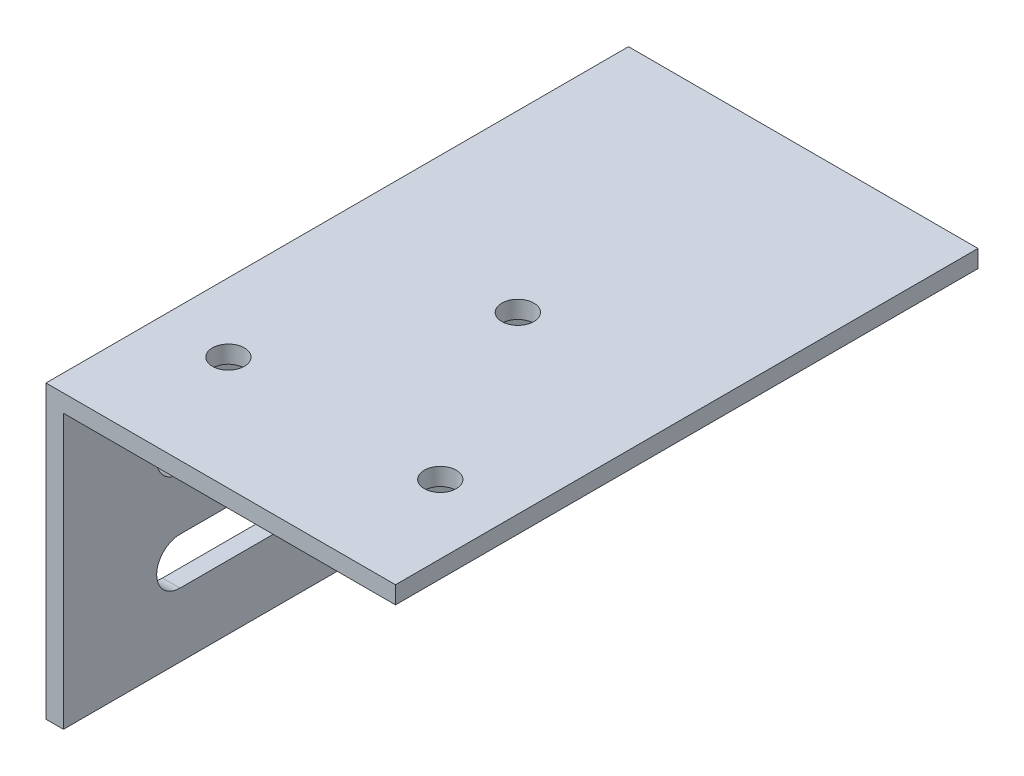
ISO-10303-21;
HEADER;
FILE_DESCRIPTION(('STEP AP214'),'2;1');
FILE_NAME('part.step','',(''),(''),'','','');
FILE_SCHEMA(('AUTOMOTIVE_DESIGN { 1 0 10303 214 1 1 1 1 }'));
ENDSEC;
DATA;
#1=APPLICATION_CONTEXT('core data for automotive mechanical design processes');
#2=APPLICATION_PROTOCOL_DEFINITION('international standard','automotive_design',2000,#1);
#3=PRODUCT_CONTEXT('',#1,'mechanical');
#4=PRODUCT('Part','Part','',(#3));
#5=PRODUCT_RELATED_PRODUCT_CATEGORY('part','',(#4));
#6=PRODUCT_DEFINITION_FORMATION('','',#4);
#7=PRODUCT_DEFINITION_CONTEXT('part definition',#1,'design');
#8=PRODUCT_DEFINITION('design','',#6,#7);
#9=PRODUCT_DEFINITION_SHAPE('','',#8);
#10=(LENGTH_UNIT() NAMED_UNIT(*) SI_UNIT(.MILLI.,.METRE.));
#11=(NAMED_UNIT(*) PLANE_ANGLE_UNIT() SI_UNIT($,.RADIAN.));
#12=(NAMED_UNIT(*) SI_UNIT($,.STERADIAN.) SOLID_ANGLE_UNIT());
#13=UNCERTAINTY_MEASURE_WITH_UNIT(LENGTH_MEASURE(1.E-05),#10,'distance_accuracy_value','');
#14=(GEOMETRIC_REPRESENTATION_CONTEXT(3) GLOBAL_UNCERTAINTY_ASSIGNED_CONTEXT((#13)) GLOBAL_UNIT_ASSIGNED_CONTEXT((#10,
#11,#12)) REPRESENTATION_CONTEXT('',''));
#15=CARTESIAN_POINT('',(0.,0.,0.));
#16=DIRECTION('',(0.,0.,1.));
#17=DIRECTION('',(1.,0.,0.));
#18=AXIS2_PLACEMENT_3D('',#15,#16,#17);
#19=CARTESIAN_POINT('',(0.,-3.,100.));
#20=DIRECTION('',(-1.,0.,0.));
#21=DIRECTION('',(0.,0.,1.));
#22=AXIS2_PLACEMENT_3D('',#19,#20,#21);
#23=PLANE('',#22);
#24=DIRECTION('',(0.,1.,0.));
#25=VECTOR('',#24,1.);
#26=CARTESIAN_POINT('',(0.,-3.,0.));
#27=LINE('',#26,#25);
#28=CARTESIAN_POINT('',(0.,-3.,0.));
#29=VERTEX_POINT('',#28);
#30=CARTESIAN_POINT('',(0.,0.,0.));
#31=VERTEX_POINT('',#30);
#32=EDGE_CURVE('E233',#29,#31,#27,.T.);
#33=ORIENTED_EDGE('',*,*,#32,.T.);
#34=DIRECTION('',(0.,0.,-1.));
#35=VECTOR('',#34,1.);
#36=CARTESIAN_POINT('',(0.,0.,100.));
#37=LINE('',#36,#35);
#38=CARTESIAN_POINT('',(0.,0.,100.));
#39=VERTEX_POINT('',#38);
#40=EDGE_CURVE('E11',#39,#31,#37,.T.);
#41=ORIENTED_EDGE('',*,*,#40,.F.);
#42=DIRECTION('',(0.,1.,0.));
#43=VECTOR('',#42,1.);
#44=CARTESIAN_POINT('',(0.,-3.,100.));
#45=LINE('',#44,#43);
#46=CARTESIAN_POINT('',(0.,-3.,100.));
#47=VERTEX_POINT('',#46);
#48=EDGE_CURVE('E218',#47,#39,#45,.T.);
#49=ORIENTED_EDGE('',*,*,#48,.F.);
#50=DIRECTION('',(0.,0.,-1.));
#51=VECTOR('',#50,1.);
#52=CARTESIAN_POINT('',(0.,-3.,100.));
#53=LINE('',#52,#51);
#54=EDGE_CURVE('E232',#47,#29,#53,.T.);
#55=ORIENTED_EDGE('',*,*,#54,.T.);
#56=EDGE_LOOP('',(#33,#41,#49,#55));
#57=FACE_BOUND('',#56,.T.);
#58=ADVANCED_FACE('F36',(#57),#23,.F.);
#59=CARTESIAN_POINT('',(0.,0.,100.));
#60=DIRECTION('',(0.,-1.,0.));
#61=DIRECTION('',(1.,0.,0.));
#62=AXIS2_PLACEMENT_3D('',#59,#60,#61);
#63=PLANE('',#62);
#64=CARTESIAN_POINT('',(-11.8134665205268,0.,80.5));
#65=DIRECTION('',(0.,1.,0.));
#66=DIRECTION('',(-1.,0.,0.));
#67=AXIS2_PLACEMENT_3D('',#64,#65,#66);
#68=CIRCLE('',#67,2.74999999999999);
#69=CARTESIAN_POINT('',(-14.5634665205268,0.,80.5));
#70=VERTEX_POINT('',#69);
#71=EDGE_CURVE('E209',#70,#70,#68,.T.);
#72=ORIENTED_EDGE('',*,*,#71,.F.);
#73=EDGE_LOOP('',(#72));
#74=FACE_BOUND('',#73,.T.);
#75=CARTESIAN_POINT('',(-48.1865334794733,0.,80.5000000000002));
#76=DIRECTION('',(0.,1.,0.));
#77=DIRECTION('',(-1.,0.,0.));
#78=AXIS2_PLACEMENT_3D('',#75,#76,#77);
#79=CIRCLE('',#78,2.75);
#80=CARTESIAN_POINT('',(-50.9365334794733,0.,80.5000000000002));
#81=VERTEX_POINT('',#80);
#82=EDGE_CURVE('E213',#81,#81,#79,.T.);
#83=ORIENTED_EDGE('',*,*,#82,.F.);
#84=EDGE_LOOP('',(#83));
#85=FACE_BOUND('',#84,.T.);
#86=CARTESIAN_POINT('',(-30.,0.,49.0000000000001));
#87=DIRECTION('',(0.,1.,0.));
#88=DIRECTION('',(-1.,0.,0.));
#89=AXIS2_PLACEMENT_3D('',#86,#87,#88);
#90=CIRCLE('',#89,2.74999999999999);
#91=CARTESIAN_POINT('',(-32.75,0.,49.0000000000001));
#92=VERTEX_POINT('',#91);
#93=EDGE_CURVE('E208',#92,#92,#90,.T.);
#94=ORIENTED_EDGE('',*,*,#93,.F.);
#95=EDGE_LOOP('',(#94));
#96=FACE_BOUND('',#95,.T.);
#97=DIRECTION('',(-1.,0.,0.));
#98=VECTOR('',#97,1.);
#99=CARTESIAN_POINT('',(0.,0.,0.));
#100=LINE('',#99,#98);
#101=CARTESIAN_POINT('',(-60.,0.,0.));
#102=VERTEX_POINT('',#101);
#103=EDGE_CURVE('E236',#31,#102,#100,.T.);
#104=ORIENTED_EDGE('',*,*,#103,.T.);
#105=DIRECTION('',(0.,0.,-1.));
#106=VECTOR('',#105,1.);
#107=CARTESIAN_POINT('',(-60.,0.,100.));
#108=LINE('',#107,#106);
#109=CARTESIAN_POINT('',(-60.,0.,100.));
#110=VERTEX_POINT('',#109);
#111=EDGE_CURVE('E44',#110,#102,#108,.T.);
#112=ORIENTED_EDGE('',*,*,#111,.F.);
#113=DIRECTION('',(-1.,0.,0.));
#114=VECTOR('',#113,1.);
#115=CARTESIAN_POINT('',(0.,0.,100.));
#116=LINE('',#115,#114);
#117=EDGE_CURVE('E221',#39,#110,#116,.T.);
#118=ORIENTED_EDGE('',*,*,#117,.F.);
#119=ORIENTED_EDGE('',*,*,#40,.T.);
#120=EDGE_LOOP('',(#104,#112,#118,#119));
#121=FACE_BOUND('',#120,.T.);
#122=ADVANCED_FACE('F285',(#74,#85,#96,#121),#63,.F.);
#123=CARTESIAN_POINT('',(-60.,0.,100.));
#124=DIRECTION('',(1.,0.,0.));
#125=DIRECTION('',(0.,1.,0.));
#126=AXIS2_PLACEMENT_3D('',#123,#124,#125);
#127=PLANE('',#126);
#128=DIRECTION('',(0.,0.,1.));
#129=VECTOR('',#128,1.);
#130=CARTESIAN_POINT('',(-60.,-14.,100.));
#131=LINE('',#130,#129);
#132=CARTESIAN_POINT('',(-60.,-14.,20.));
#133=VERTEX_POINT('',#132);
#134=CARTESIAN_POINT('',(-60.,-14.,80.));
#135=VERTEX_POINT('',#134);
#136=EDGE_CURVE('E202',#133,#135,#131,.T.);
#137=ORIENTED_EDGE('',*,*,#136,.T.);
#138=CARTESIAN_POINT('',(-60.,-18.,80.));
#139=DIRECTION('',(1.,0.,0.));
#140=DIRECTION('',(0.,1.,0.));
#141=AXIS2_PLACEMENT_3D('',#138,#139,#140);
#142=CIRCLE('',#141,4.);
#143=CARTESIAN_POINT('',(-60.,-22.,80.));
#144=VERTEX_POINT('',#143);
#145=EDGE_CURVE('E205',#135,#144,#142,.T.);
#146=ORIENTED_EDGE('',*,*,#145,.T.);
#147=DIRECTION('',(0.,0.,-1.));
#148=VECTOR('',#147,1.);
#149=CARTESIAN_POINT('',(-60.,-22.,100.));
#150=LINE('',#149,#148);
#151=CARTESIAN_POINT('',(-60.,-22.,20.));
#152=VERTEX_POINT('',#151);
#153=EDGE_CURVE('E199',#144,#152,#150,.T.);
#154=ORIENTED_EDGE('',*,*,#153,.T.);
#155=CARTESIAN_POINT('',(-60.,-18.,20.));
#156=DIRECTION('',(1.,0.,0.));
#157=DIRECTION('',(0.,1.,0.));
#158=AXIS2_PLACEMENT_3D('',#155,#156,#157);
#159=CIRCLE('',#158,4.);
#160=EDGE_CURVE('E143',#152,#133,#159,.T.);
#161=ORIENTED_EDGE('',*,*,#160,.T.);
#162=EDGE_LOOP('',(#137,#146,#154,#161));
#163=FACE_BOUND('',#162,.T.);
#164=DIRECTION('',(0.,0.,1.));
#165=VECTOR('',#164,1.);
#166=CARTESIAN_POINT('',(-60.,-31.,100.));
#167=LINE('',#166,#165);
#168=CARTESIAN_POINT('',(-60.,-31.,20.));
#169=VERTEX_POINT('',#168);
#170=CARTESIAN_POINT('',(-60.,-31.,80.));
#171=VERTEX_POINT('',#170);
#172=EDGE_CURVE('E193',#169,#171,#167,.T.);
#173=ORIENTED_EDGE('',*,*,#172,.T.);
#174=CARTESIAN_POINT('',(-60.,-35.,80.));
#175=DIRECTION('',(1.,0.,0.));
#176=DIRECTION('',(0.,1.,0.));
#177=AXIS2_PLACEMENT_3D('',#174,#175,#176);
#178=CIRCLE('',#177,4.);
#179=CARTESIAN_POINT('',(-60.,-39.,80.));
#180=VERTEX_POINT('',#179);
#181=EDGE_CURVE('E196',#171,#180,#178,.T.);
#182=ORIENTED_EDGE('',*,*,#181,.T.);
#183=DIRECTION('',(0.,0.,-1.));
#184=VECTOR('',#183,1.);
#185=CARTESIAN_POINT('',(-60.,-39.,100.));
#186=LINE('',#185,#184);
#187=CARTESIAN_POINT('',(-60.,-39.,20.));
#188=VERTEX_POINT('',#187);
#189=EDGE_CURVE('E167',#180,#188,#186,.T.);
#190=ORIENTED_EDGE('',*,*,#189,.T.);
#191=CARTESIAN_POINT('',(-60.,-35.,20.));
#192=DIRECTION('',(1.,0.,0.));
#193=DIRECTION('',(0.,1.,0.));
#194=AXIS2_PLACEMENT_3D('',#191,#192,#193);
#195=CIRCLE('',#194,4.);
#196=EDGE_CURVE('E190',#188,#169,#195,.T.);
#197=ORIENTED_EDGE('',*,*,#196,.T.);
#198=EDGE_LOOP('',(#173,#182,#190,#197));
#199=FACE_BOUND('',#198,.T.);
#200=DIRECTION('',(0.,-1.,0.));
#201=VECTOR('',#200,1.);
#202=CARTESIAN_POINT('',(-60.,0.,0.));
#203=LINE('',#202,#201);
#204=CARTESIAN_POINT('',(-60.,-50.,0.));
#205=VERTEX_POINT('',#204);
#206=EDGE_CURVE('E238',#102,#205,#203,.T.);
#207=ORIENTED_EDGE('',*,*,#206,.T.);
#208=DIRECTION('',(0.,0.,-1.));
#209=VECTOR('',#208,1.);
#210=CARTESIAN_POINT('',(-60.,-50.,100.));
#211=LINE('',#210,#209);
#212=CARTESIAN_POINT('',(-60.,-50.,100.));
#213=VERTEX_POINT('',#212);
#214=EDGE_CURVE('E253',#213,#205,#211,.T.);
#215=ORIENTED_EDGE('',*,*,#214,.F.);
#216=DIRECTION('',(0.,-1.,0.));
#217=VECTOR('',#216,1.);
#218=CARTESIAN_POINT('',(-60.,0.,100.));
#219=LINE('',#218,#217);
#220=EDGE_CURVE('E224',#110,#213,#219,.T.);
#221=ORIENTED_EDGE('',*,*,#220,.F.);
#222=ORIENTED_EDGE('',*,*,#111,.T.);
#223=EDGE_LOOP('',(#207,#215,#221,#222));
#224=FACE_BOUND('',#223,.T.);
#225=ADVANCED_FACE('F290',(#163,#199,#224),#127,.F.);
#226=CARTESIAN_POINT('',(-60.,-50.,100.));
#227=DIRECTION('',(0.,1.,0.));
#228=DIRECTION('',(0.,0.,1.));
#229=AXIS2_PLACEMENT_3D('',#226,#227,#228);
#230=PLANE('',#229);
#231=DIRECTION('',(1.,0.,0.));
#232=VECTOR('',#231,1.);
#233=CARTESIAN_POINT('',(-60.,-50.,0.));
#234=LINE('',#233,#232);
#235=CARTESIAN_POINT('',(-57.,-50.,0.));
#236=VERTEX_POINT('',#235);
#237=EDGE_CURVE('E240',#205,#236,#234,.T.);
#238=ORIENTED_EDGE('',*,*,#237,.T.);
#239=DIRECTION('',(0.,0.,-1.));
#240=VECTOR('',#239,1.);
#241=CARTESIAN_POINT('',(-57.,-50.,100.));
#242=LINE('',#241,#240);
#243=CARTESIAN_POINT('',(-57.,-50.,100.));
#244=VERTEX_POINT('',#243);
#245=EDGE_CURVE('E250',#244,#236,#242,.T.);
#246=ORIENTED_EDGE('',*,*,#245,.F.);
#247=DIRECTION('',(1.,0.,0.));
#248=VECTOR('',#247,1.);
#249=CARTESIAN_POINT('',(-60.,-50.,100.));
#250=LINE('',#249,#248);
#251=EDGE_CURVE('E226',#213,#244,#250,.T.);
#252=ORIENTED_EDGE('',*,*,#251,.F.);
#253=ORIENTED_EDGE('',*,*,#214,.T.);
#254=EDGE_LOOP('',(#238,#246,#252,#253));
#255=FACE_BOUND('',#254,.T.);
#256=ADVANCED_FACE('F314',(#255),#230,.F.);
#257=CARTESIAN_POINT('',(-57.,-50.,100.));
#258=DIRECTION('',(-1.,0.,0.));
#259=DIRECTION('',(0.,0.,1.));
#260=AXIS2_PLACEMENT_3D('',#257,#258,#259);
#261=PLANE('',#260);
#262=DIRECTION('',(0.,0.,-1.));
#263=VECTOR('',#262,1.);
#264=CARTESIAN_POINT('',(-57.,-22.,80.));
#265=LINE('',#264,#263);
#266=CARTESIAN_POINT('',(-57.,-22.,80.));
#267=VERTEX_POINT('',#266);
#268=CARTESIAN_POINT('',(-57.,-22.,20.));
#269=VERTEX_POINT('',#268);
#270=EDGE_CURVE('E150',#267,#269,#265,.T.);
#271=ORIENTED_EDGE('',*,*,#270,.F.);
#272=CARTESIAN_POINT('',(-57.,-18.,80.));
#273=DIRECTION('',(1.,0.,0.));
#274=DIRECTION('',(0.,0.,-1.));
#275=AXIS2_PLACEMENT_3D('',#272,#273,#274);
#276=CIRCLE('',#275,4.);
#277=CARTESIAN_POINT('',(-57.,-14.,80.));
#278=VERTEX_POINT('',#277);
#279=EDGE_CURVE('E155',#278,#267,#276,.T.);
#280=ORIENTED_EDGE('',*,*,#279,.F.);
#281=DIRECTION('',(0.,0.,1.));
#282=VECTOR('',#281,1.);
#283=CARTESIAN_POINT('',(-57.,-14.,80.));
#284=LINE('',#283,#282);
#285=CARTESIAN_POINT('',(-57.,-14.,20.));
#286=VERTEX_POINT('',#285);
#287=EDGE_CURVE('E160',#286,#278,#284,.T.);
#288=ORIENTED_EDGE('',*,*,#287,.F.);
#289=CARTESIAN_POINT('',(-57.,-18.,20.));
#290=DIRECTION('',(1.,0.,0.));
#291=DIRECTION('',(0.,0.,-1.));
#292=AXIS2_PLACEMENT_3D('',#289,#290,#291);
#293=CIRCLE('',#292,4.);
#294=EDGE_CURVE('E140',#269,#286,#293,.T.);
#295=ORIENTED_EDGE('',*,*,#294,.F.);
#296=EDGE_LOOP('',(#271,#280,#288,#295));
#297=FACE_BOUND('',#296,.T.);
#298=DIRECTION('',(0.,0.,-1.));
#299=VECTOR('',#298,1.);
#300=CARTESIAN_POINT('',(-57.,-39.,80.));
#301=LINE('',#300,#299);
#302=CARTESIAN_POINT('',(-57.,-39.,80.));
#303=VERTEX_POINT('',#302);
#304=CARTESIAN_POINT('',(-57.,-39.,20.));
#305=VERTEX_POINT('',#304);
#306=EDGE_CURVE('E172',#303,#305,#301,.T.);
#307=ORIENTED_EDGE('',*,*,#306,.F.);
#308=CARTESIAN_POINT('',(-57.,-35.,80.));
#309=DIRECTION('',(1.,0.,0.));
#310=DIRECTION('',(0.,0.,1.));
#311=AXIS2_PLACEMENT_3D('',#308,#309,#310);
#312=CIRCLE('',#311,4.);
#313=CARTESIAN_POINT('',(-57.,-31.,80.));
#314=VERTEX_POINT('',#313);
#315=EDGE_CURVE('E170',#314,#303,#312,.T.);
#316=ORIENTED_EDGE('',*,*,#315,.F.);
#317=DIRECTION('',(0.,0.,1.));
#318=VECTOR('',#317,1.);
#319=CARTESIAN_POINT('',(-57.,-31.,80.));
#320=LINE('',#319,#318);
#321=CARTESIAN_POINT('',(-57.,-31.,20.));
#322=VERTEX_POINT('',#321);
#323=EDGE_CURVE('E177',#322,#314,#320,.T.);
#324=ORIENTED_EDGE('',*,*,#323,.F.);
#325=CARTESIAN_POINT('',(-57.,-35.,20.));
#326=DIRECTION('',(1.,0.,0.));
#327=DIRECTION('',(0.,0.,1.));
#328=AXIS2_PLACEMENT_3D('',#325,#326,#327);
#329=CIRCLE('',#328,4.);
#330=EDGE_CURVE('E174',#305,#322,#329,.T.);
#331=ORIENTED_EDGE('',*,*,#330,.F.);
#332=EDGE_LOOP('',(#307,#316,#324,#331));
#333=FACE_BOUND('',#332,.T.);
#334=DIRECTION('',(0.,1.,0.));
#335=VECTOR('',#334,1.);
#336=CARTESIAN_POINT('',(-57.,-50.,0.));
#337=LINE('',#336,#335);
#338=CARTESIAN_POINT('',(-57.,-3.,0.));
#339=VERTEX_POINT('',#338);
#340=EDGE_CURVE('E242',#236,#339,#337,.T.);
#341=ORIENTED_EDGE('',*,*,#340,.T.);
#342=DIRECTION('',(0.,0.,-1.));
#343=VECTOR('',#342,1.);
#344=CARTESIAN_POINT('',(-57.,-3.,100.));
#345=LINE('',#344,#343);
#346=CARTESIAN_POINT('',(-57.,-3.,100.));
#347=VERTEX_POINT('',#346);
#348=EDGE_CURVE('E247',#347,#339,#345,.T.);
#349=ORIENTED_EDGE('',*,*,#348,.F.);
#350=DIRECTION('',(0.,1.,0.));
#351=VECTOR('',#350,1.);
#352=CARTESIAN_POINT('',(-57.,-50.,100.));
#353=LINE('',#352,#351);
#354=EDGE_CURVE('E228',#244,#347,#353,.T.);
#355=ORIENTED_EDGE('',*,*,#354,.F.);
#356=ORIENTED_EDGE('',*,*,#245,.T.);
#357=EDGE_LOOP('',(#341,#349,#355,#356));
#358=FACE_BOUND('',#357,.T.);
#359=ADVANCED_FACE('F157',(#297,#333,#358),#261,.F.);
#360=CARTESIAN_POINT('',(-57.,-3.,100.));
#361=DIRECTION('',(0.,1.,0.));
#362=DIRECTION('',(-1.,0.,0.));
#363=AXIS2_PLACEMENT_3D('',#360,#361,#362);
#364=PLANE('',#363);
#365=CARTESIAN_POINT('',(-11.8134665205268,-3.,80.5));
#366=DIRECTION('',(0.,1.,0.));
#367=DIRECTION('',(-1.,0.,0.));
#368=AXIS2_PLACEMENT_3D('',#365,#366,#367);
#369=CIRCLE('',#368,2.74999999999999);
#370=CARTESIAN_POINT('',(-14.5634665205268,-3.,80.5));
#371=VERTEX_POINT('',#370);
#372=EDGE_CURVE('E39',#371,#371,#369,.T.);
#373=ORIENTED_EDGE('',*,*,#372,.T.);
#374=EDGE_LOOP('',(#373));
#375=FACE_BOUND('',#374,.T.);
#376=CARTESIAN_POINT('',(-48.1865334794733,-3.,80.5000000000002));
#377=DIRECTION('',(0.,1.,0.));
#378=DIRECTION('',(-1.,0.,0.));
#379=AXIS2_PLACEMENT_3D('',#376,#377,#378);
#380=CIRCLE('',#379,2.75);
#381=CARTESIAN_POINT('',(-50.9365334794733,-3.,80.5000000000002));
#382=VERTEX_POINT('',#381);
#383=EDGE_CURVE('E259',#382,#382,#380,.T.);
#384=ORIENTED_EDGE('',*,*,#383,.T.);
#385=EDGE_LOOP('',(#384));
#386=FACE_BOUND('',#385,.T.);
#387=CARTESIAN_POINT('',(-30.,-3.,49.0000000000001));
#388=DIRECTION('',(0.,1.,0.));
#389=DIRECTION('',(-1.,0.,0.));
#390=AXIS2_PLACEMENT_3D('',#387,#388,#389);
#391=CIRCLE('',#390,2.74999999999999);
#392=CARTESIAN_POINT('',(-32.75,-3.,49.0000000000001));
#393=VERTEX_POINT('',#392);
#394=EDGE_CURVE('E212',#393,#393,#391,.T.);
#395=ORIENTED_EDGE('',*,*,#394,.T.);
#396=EDGE_LOOP('',(#395));
#397=FACE_BOUND('',#396,.T.);
#398=DIRECTION('',(1.,0.,0.));
#399=VECTOR('',#398,1.);
#400=CARTESIAN_POINT('',(-57.,-3.,0.));
#401=LINE('',#400,#399);
#402=EDGE_CURVE('E222',#339,#29,#401,.T.);
#403=ORIENTED_EDGE('',*,*,#402,.T.);
#404=ORIENTED_EDGE('',*,*,#54,.F.);
#405=DIRECTION('',(1.,0.,0.));
#406=VECTOR('',#405,1.);
#407=CARTESIAN_POINT('',(-57.,-3.,100.));
#408=LINE('',#407,#406);
#409=EDGE_CURVE('E230',#347,#47,#408,.T.);
#410=ORIENTED_EDGE('',*,*,#409,.F.);
#411=ORIENTED_EDGE('',*,*,#348,.T.);
#412=EDGE_LOOP('',(#403,#404,#410,#411));
#413=FACE_BOUND('',#412,.T.);
#414=ADVANCED_FACE('F266',(#375,#386,#397,#413),#364,.F.);
#415=CARTESIAN_POINT('',(0.,0.,100.));
#416=DIRECTION('',(0.,0.,1.));
#417=DIRECTION('',(1.,0.,0.));
#418=AXIS2_PLACEMENT_3D('',#415,#416,#417);
#419=PLANE('',#418);
#420=ORIENTED_EDGE('',*,*,#48,.T.);
#421=ORIENTED_EDGE('',*,*,#117,.T.);
#422=ORIENTED_EDGE('',*,*,#220,.T.);
#423=ORIENTED_EDGE('',*,*,#251,.T.);
#424=ORIENTED_EDGE('',*,*,#354,.T.);
#425=ORIENTED_EDGE('',*,*,#409,.T.);
#426=EDGE_LOOP('',(#420,#421,#422,#423,#424,#425));
#427=FACE_BOUND('',#426,.T.);
#428=ADVANCED_FACE('F306',(#427),#419,.T.);
#429=CARTESIAN_POINT('',(0.,0.,0.));
#430=DIRECTION('',(0.,0.,1.));
#431=DIRECTION('',(1.,0.,0.));
#432=AXIS2_PLACEMENT_3D('',#429,#430,#431);
#433=PLANE('',#432);
#434=ORIENTED_EDGE('',*,*,#32,.F.);
#435=ORIENTED_EDGE('',*,*,#402,.F.);
#436=ORIENTED_EDGE('',*,*,#340,.F.);
#437=ORIENTED_EDGE('',*,*,#237,.F.);
#438=ORIENTED_EDGE('',*,*,#206,.F.);
#439=ORIENTED_EDGE('',*,*,#103,.F.);
#440=EDGE_LOOP('',(#434,#435,#436,#437,#438,#439));
#441=FACE_BOUND('',#440,.T.);
#442=ADVANCED_FACE('F298',(#441),#433,.F.);
#443=CARTESIAN_POINT('',(-30.,-100.,49.0000000000001));
#444=DIRECTION('',(0.,1.,0.));
#445=DIRECTION('',(-1.,0.,0.));
#446=AXIS2_PLACEMENT_3D('',#443,#444,#445);
#447=CYLINDRICAL_SURFACE('',#446,2.74999999999999);
#448=ORIENTED_EDGE('',*,*,#93,.T.);
#449=EDGE_LOOP('',(#448));
#450=FACE_BOUND('',#449,.T.);
#451=ORIENTED_EDGE('',*,*,#394,.F.);
#452=EDGE_LOOP('',(#451));
#453=FACE_BOUND('',#452,.T.);
#454=ADVANCED_FACE('F281',(#450,#453),#447,.F.);
#455=CARTESIAN_POINT('',(-48.1865334794733,-100.,80.5000000000002));
#456=DIRECTION('',(0.,1.,0.));
#457=DIRECTION('',(-1.,0.,0.));
#458=AXIS2_PLACEMENT_3D('',#455,#456,#457);
#459=CYLINDRICAL_SURFACE('',#458,2.75);
#460=ORIENTED_EDGE('',*,*,#82,.T.);
#461=EDGE_LOOP('',(#460));
#462=FACE_BOUND('',#461,.T.);
#463=ORIENTED_EDGE('',*,*,#383,.F.);
#464=EDGE_LOOP('',(#463));
#465=FACE_BOUND('',#464,.T.);
#466=ADVANCED_FACE('F271',(#462,#465),#459,.F.);
#467=CARTESIAN_POINT('',(-11.8134665205268,-100.,80.5));
#468=DIRECTION('',(0.,1.,0.));
#469=DIRECTION('',(-1.,0.,0.));
#470=AXIS2_PLACEMENT_3D('',#467,#468,#469);
#471=CYLINDRICAL_SURFACE('',#470,2.74999999999999);
#472=ORIENTED_EDGE('',*,*,#71,.T.);
#473=EDGE_LOOP('',(#472));
#474=FACE_BOUND('',#473,.T.);
#475=ORIENTED_EDGE('',*,*,#372,.F.);
#476=EDGE_LOOP('',(#475));
#477=FACE_BOUND('',#476,.T.);
#478=ADVANCED_FACE('F268',(#474,#477),#471,.F.);
#479=CARTESIAN_POINT('',(-157.,-35.,80.));
#480=DIRECTION('',(1.,0.,0.));
#481=DIRECTION('',(0.,0.,-1.));
#482=AXIS2_PLACEMENT_3D('',#479,#480,#481);
#483=CYLINDRICAL_SURFACE('',#482,4.);
#484=DIRECTION('',(1.,0.,0.));
#485=VECTOR('',#484,1.);
#486=CARTESIAN_POINT('',(-157.,-31.,80.));
#487=LINE('',#486,#485);
#488=EDGE_CURVE('E181',#171,#314,#487,.T.);
#489=ORIENTED_EDGE('',*,*,#488,.T.);
#490=ORIENTED_EDGE('',*,*,#315,.T.);
#491=DIRECTION('',(1.,0.,0.));
#492=VECTOR('',#491,1.);
#493=CARTESIAN_POINT('',(-157.,-39.,80.));
#494=LINE('',#493,#492);
#495=EDGE_CURVE('E180',#180,#303,#494,.T.);
#496=ORIENTED_EDGE('',*,*,#495,.F.);
#497=ORIENTED_EDGE('',*,*,#181,.F.);
#498=EDGE_LOOP('',(#489,#490,#496,#497));
#499=FACE_BOUND('',#498,.T.);
#500=ADVANCED_FACE('F270',(#499),#483,.F.);
#501=CARTESIAN_POINT('',(-157.,-31.,80.));
#502=DIRECTION('',(0.,1.,0.));
#503=DIRECTION('',(0.,0.,1.));
#504=AXIS2_PLACEMENT_3D('',#501,#502,#503);
#505=PLANE('',#504);
#506=DIRECTION('',(1.,0.,0.));
#507=VECTOR('',#506,1.);
#508=CARTESIAN_POINT('',(-157.,-31.,20.));
#509=LINE('',#508,#507);
#510=EDGE_CURVE('E183',#169,#322,#509,.T.);
#511=ORIENTED_EDGE('',*,*,#510,.T.);
#512=ORIENTED_EDGE('',*,*,#323,.T.);
#513=ORIENTED_EDGE('',*,*,#488,.F.);
#514=ORIENTED_EDGE('',*,*,#172,.F.);
#515=EDGE_LOOP('',(#511,#512,#513,#514));
#516=FACE_BOUND('',#515,.T.);
#517=ADVANCED_FACE('F278',(#516),#505,.F.);
#518=CARTESIAN_POINT('',(-157.,-35.,20.));
#519=DIRECTION('',(1.,0.,0.));
#520=DIRECTION('',(0.,0.,-1.));
#521=AXIS2_PLACEMENT_3D('',#518,#519,#520);
#522=CYLINDRICAL_SURFACE('',#521,4.);
#523=DIRECTION('',(1.,0.,0.));
#524=VECTOR('',#523,1.);
#525=CARTESIAN_POINT('',(-157.,-39.,20.));
#526=LINE('',#525,#524);
#527=EDGE_CURVE('E60',#188,#305,#526,.T.);
#528=ORIENTED_EDGE('',*,*,#527,.T.);
#529=ORIENTED_EDGE('',*,*,#330,.T.);
#530=ORIENTED_EDGE('',*,*,#510,.F.);
#531=ORIENTED_EDGE('',*,*,#196,.F.);
#532=EDGE_LOOP('',(#528,#529,#530,#531));
#533=FACE_BOUND('',#532,.T.);
#534=ADVANCED_FACE('F383',(#533),#522,.F.);
#535=CARTESIAN_POINT('',(-157.,-39.,80.));
#536=DIRECTION('',(0.,-1.,0.));
#537=DIRECTION('',(0.,0.,-1.));
#538=AXIS2_PLACEMENT_3D('',#535,#536,#537);
#539=PLANE('',#538);
#540=ORIENTED_EDGE('',*,*,#495,.T.);
#541=ORIENTED_EDGE('',*,*,#306,.T.);
#542=ORIENTED_EDGE('',*,*,#527,.F.);
#543=ORIENTED_EDGE('',*,*,#189,.F.);
#544=EDGE_LOOP('',(#540,#541,#542,#543));
#545=FACE_BOUND('',#544,.T.);
#546=ADVANCED_FACE('F393',(#545),#539,.F.);
#547=CARTESIAN_POINT('',(-157.,-18.,80.));
#548=DIRECTION('',(1.,0.,0.));
#549=DIRECTION('',(0.,0.,-1.));
#550=AXIS2_PLACEMENT_3D('',#547,#548,#549);
#551=CYLINDRICAL_SURFACE('',#550,4.);
#552=DIRECTION('',(1.,0.,0.));
#553=VECTOR('',#552,1.);
#554=CARTESIAN_POINT('',(-157.,-14.,80.));
#555=LINE('',#554,#553);
#556=EDGE_CURVE('E165',#135,#278,#555,.T.);
#557=ORIENTED_EDGE('',*,*,#556,.T.);
#558=ORIENTED_EDGE('',*,*,#279,.T.);
#559=DIRECTION('',(1.,0.,0.));
#560=VECTOR('',#559,1.);
#561=CARTESIAN_POINT('',(-157.,-22.,80.));
#562=LINE('',#561,#560);
#563=EDGE_CURVE('E146',#144,#267,#562,.T.);
#564=ORIENTED_EDGE('',*,*,#563,.F.);
#565=ORIENTED_EDGE('',*,*,#145,.F.);
#566=EDGE_LOOP('',(#557,#558,#564,#565));
#567=FACE_BOUND('',#566,.T.);
#568=ADVANCED_FACE('F403',(#567),#551,.F.);
#569=CARTESIAN_POINT('',(-157.,-14.,80.));
#570=DIRECTION('',(0.,1.,0.));
#571=DIRECTION('',(0.,0.,1.));
#572=AXIS2_PLACEMENT_3D('',#569,#570,#571);
#573=PLANE('',#572);
#574=DIRECTION('',(1.,0.,0.));
#575=VECTOR('',#574,1.);
#576=CARTESIAN_POINT('',(-157.,-14.,20.));
#577=LINE('',#576,#575);
#578=EDGE_CURVE('E145',#133,#286,#577,.T.);
#579=ORIENTED_EDGE('',*,*,#578,.T.);
#580=ORIENTED_EDGE('',*,*,#287,.T.);
#581=ORIENTED_EDGE('',*,*,#556,.F.);
#582=ORIENTED_EDGE('',*,*,#136,.F.);
#583=EDGE_LOOP('',(#579,#580,#581,#582));
#584=FACE_BOUND('',#583,.T.);
#585=ADVANCED_FACE('F412',(#584),#573,.F.);
#586=CARTESIAN_POINT('',(-157.,-18.,20.));
#587=DIRECTION('',(1.,0.,0.));
#588=DIRECTION('',(0.,0.,-1.));
#589=AXIS2_PLACEMENT_3D('',#586,#587,#588);
#590=CYLINDRICAL_SURFACE('',#589,4.);
#591=DIRECTION('',(1.,0.,0.));
#592=VECTOR('',#591,1.);
#593=CARTESIAN_POINT('',(-157.,-22.,20.));
#594=LINE('',#593,#592);
#595=EDGE_CURVE('E52',#152,#269,#594,.T.);
#596=ORIENTED_EDGE('',*,*,#595,.T.);
#597=ORIENTED_EDGE('',*,*,#294,.T.);
#598=ORIENTED_EDGE('',*,*,#578,.F.);
#599=ORIENTED_EDGE('',*,*,#160,.F.);
#600=EDGE_LOOP('',(#596,#597,#598,#599));
#601=FACE_BOUND('',#600,.T.);
#602=ADVANCED_FACE('F137',(#601),#590,.F.);
#603=CARTESIAN_POINT('',(-157.,-22.,80.));
#604=DIRECTION('',(0.,-1.,0.));
#605=DIRECTION('',(0.,0.,-1.));
#606=AXIS2_PLACEMENT_3D('',#603,#604,#605);
#607=PLANE('',#606);
#608=ORIENTED_EDGE('',*,*,#563,.T.);
#609=ORIENTED_EDGE('',*,*,#270,.T.);
#610=ORIENTED_EDGE('',*,*,#595,.F.);
#611=ORIENTED_EDGE('',*,*,#153,.F.);
#612=EDGE_LOOP('',(#608,#609,#610,#611));
#613=FACE_BOUND('',#612,.T.);
#614=ADVANCED_FACE('F151',(#613),#607,.F.);
#615=CLOSED_SHELL('',(#58,#122,#225,#256,#359,#414,#428,#442,#454,#466,#478,#500,#517,#534,#546,
#568,#585,#602,#614));
#616=MANIFOLD_SOLID_BREP('B2',#615);
#617=ADVANCED_BREP_SHAPE_REPRESENTATION('',(#18,#616),#14);
#618=SHAPE_DEFINITION_REPRESENTATION(#9,#617);
ENDSEC;
END-ISO-10303-21;
